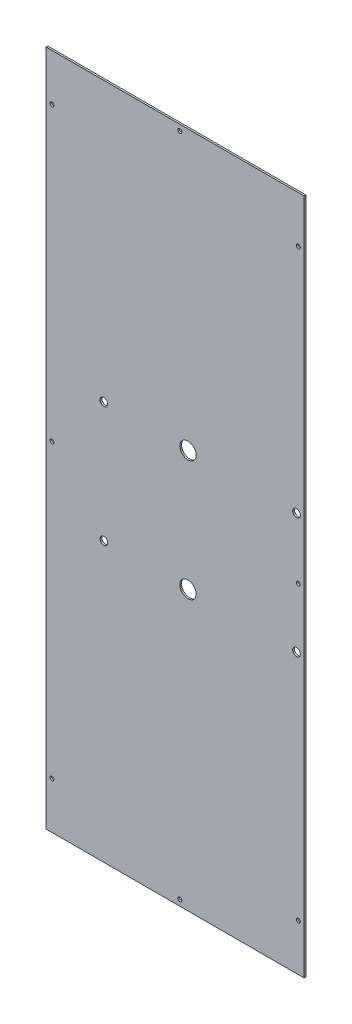
ISO-10303-21;
HEADER;
FILE_DESCRIPTION(('STEP AP214'),'2;1');
FILE_NAME('part.step','',(''),(''),'','','');
FILE_SCHEMA(('AUTOMOTIVE_DESIGN { 1 0 10303 214 1 1 1 1 }'));
ENDSEC;
DATA;
#1=APPLICATION_CONTEXT('core data for automotive mechanical design processes');
#2=APPLICATION_PROTOCOL_DEFINITION('international standard','automotive_design',2000,#1);
#3=PRODUCT_CONTEXT('',#1,'mechanical');
#4=PRODUCT('Part','Part','',(#3));
#5=PRODUCT_RELATED_PRODUCT_CATEGORY('part','',(#4));
#6=PRODUCT_DEFINITION_FORMATION('','',#4);
#7=PRODUCT_DEFINITION_CONTEXT('part definition',#1,'design');
#8=PRODUCT_DEFINITION('design','',#6,#7);
#9=PRODUCT_DEFINITION_SHAPE('','',#8);
#10=(LENGTH_UNIT() NAMED_UNIT(*) SI_UNIT(.MILLI.,.METRE.));
#11=(NAMED_UNIT(*) PLANE_ANGLE_UNIT() SI_UNIT($,.RADIAN.));
#12=(NAMED_UNIT(*) SI_UNIT($,.STERADIAN.) SOLID_ANGLE_UNIT());
#13=UNCERTAINTY_MEASURE_WITH_UNIT(LENGTH_MEASURE(1.E-05),#10,'distance_accuracy_value','');
#14=(GEOMETRIC_REPRESENTATION_CONTEXT(3) GLOBAL_UNCERTAINTY_ASSIGNED_CONTEXT((#13)) GLOBAL_UNIT_ASSIGNED_CONTEXT((#10,
#11,#12)) REPRESENTATION_CONTEXT('',''));
#15=CARTESIAN_POINT('',(0.,0.,0.));
#16=DIRECTION('',(0.,0.,1.));
#17=DIRECTION('',(1.,0.,0.));
#18=AXIS2_PLACEMENT_3D('',#15,#16,#17);
#19=CARTESIAN_POINT('',(-139.5,290.,110.));
#20=DIRECTION('',(-1.,0.,0.));
#21=DIRECTION('',(0.,0.,1.));
#22=AXIS2_PLACEMENT_3D('',#19,#20,#21);
#23=PLANE('',#22);
#24=DIRECTION('',(0.,-1.,0.));
#25=VECTOR('',#24,1.);
#26=CARTESIAN_POINT('',(-139.5,290.,111.5));
#27=LINE('',#26,#25);
#28=CARTESIAN_POINT('',(-139.5,290.,111.5));
#29=VERTEX_POINT('',#28);
#30=CARTESIAN_POINT('',(-139.5,-290.,111.5));
#31=VERTEX_POINT('',#30);
#32=EDGE_CURVE('E106',#29,#31,#27,.T.);
#33=ORIENTED_EDGE('',*,*,#32,.F.);
#34=DIRECTION('',(0.,0.,1.));
#35=VECTOR('',#34,1.);
#36=CARTESIAN_POINT('',(-139.5,290.,110.));
#37=LINE('',#36,#35);
#38=CARTESIAN_POINT('',(-139.5,290.,110.));
#39=VERTEX_POINT('',#38);
#40=EDGE_CURVE('E11',#39,#29,#37,.T.);
#41=ORIENTED_EDGE('',*,*,#40,.F.);
#42=DIRECTION('',(0.,-1.,0.));
#43=VECTOR('',#42,1.);
#44=CARTESIAN_POINT('',(-139.5,290.,110.));
#45=LINE('',#44,#43);
#46=CARTESIAN_POINT('',(-139.5,-290.,110.));
#47=VERTEX_POINT('',#46);
#48=EDGE_CURVE('E97',#39,#47,#45,.T.);
#49=ORIENTED_EDGE('',*,*,#48,.T.);
#50=DIRECTION('',(0.,0.,1.));
#51=VECTOR('',#50,1.);
#52=CARTESIAN_POINT('',(-139.5,-290.,110.));
#53=LINE('',#52,#51);
#54=EDGE_CURVE('E42',#47,#31,#53,.T.);
#55=ORIENTED_EDGE('',*,*,#54,.T.);
#56=EDGE_LOOP('',(#33,#41,#49,#55));
#57=FACE_BOUND('',#56,.T.);
#58=ADVANCED_FACE('F41',(#57),#23,.T.);
#59=CARTESIAN_POINT('',(-139.5,290.,110.));
#60=DIRECTION('',(0.,1.,0.));
#61=DIRECTION('',(0.,0.,1.));
#62=AXIS2_PLACEMENT_3D('',#59,#60,#61);
#63=PLANE('',#62);
#64=DIRECTION('',(-1.,0.,0.));
#65=VECTOR('',#64,1.);
#66=CARTESIAN_POINT('',(-139.5,290.,111.5));
#67=LINE('',#66,#65);
#68=CARTESIAN_POINT('',(81.5,290.,111.5));
#69=VERTEX_POINT('',#68);
#70=EDGE_CURVE('E101',#69,#29,#67,.T.);
#71=ORIENTED_EDGE('',*,*,#70,.F.);
#72=DIRECTION('',(0.,0.,1.));
#73=VECTOR('',#72,1.);
#74=CARTESIAN_POINT('',(81.5,290.,110.));
#75=LINE('',#74,#73);
#76=CARTESIAN_POINT('',(81.5,290.,110.));
#77=VERTEX_POINT('',#76);
#78=EDGE_CURVE('E49',#77,#69,#75,.T.);
#79=ORIENTED_EDGE('',*,*,#78,.F.);
#80=DIRECTION('',(-1.,0.,0.));
#81=VECTOR('',#80,1.);
#82=CARTESIAN_POINT('',(-139.5,290.,110.));
#83=LINE('',#82,#81);
#84=EDGE_CURVE('E96',#77,#39,#83,.T.);
#85=ORIENTED_EDGE('',*,*,#84,.T.);
#86=ORIENTED_EDGE('',*,*,#40,.T.);
#87=EDGE_LOOP('',(#71,#79,#85,#86));
#88=FACE_BOUND('',#87,.T.);
#89=ADVANCED_FACE('F120',(#88),#63,.T.);
#90=CARTESIAN_POINT('',(81.5,290.,110.));
#91=DIRECTION('',(1.,0.,0.));
#92=DIRECTION('',(0.,0.,-1.));
#93=AXIS2_PLACEMENT_3D('',#90,#91,#92);
#94=PLANE('',#93);
#95=DIRECTION('',(0.,1.,0.));
#96=VECTOR('',#95,1.);
#97=CARTESIAN_POINT('',(81.5,290.,111.5));
#98=LINE('',#97,#96);
#99=CARTESIAN_POINT('',(81.5,-290.,111.5));
#100=VERTEX_POINT('',#99);
#101=EDGE_CURVE('E93',#100,#69,#98,.T.);
#102=ORIENTED_EDGE('',*,*,#101,.F.);
#103=DIRECTION('',(0.,0.,1.));
#104=VECTOR('',#103,1.);
#105=CARTESIAN_POINT('',(81.5,-290.,110.));
#106=LINE('',#105,#104);
#107=CARTESIAN_POINT('',(81.5,-290.,110.));
#108=VERTEX_POINT('',#107);
#109=EDGE_CURVE('E88',#108,#100,#106,.T.);
#110=ORIENTED_EDGE('',*,*,#109,.F.);
#111=DIRECTION('',(0.,1.,0.));
#112=VECTOR('',#111,1.);
#113=CARTESIAN_POINT('',(81.5,290.,110.));
#114=LINE('',#113,#112);
#115=EDGE_CURVE('E90',#108,#77,#114,.T.);
#116=ORIENTED_EDGE('',*,*,#115,.T.);
#117=ORIENTED_EDGE('',*,*,#78,.T.);
#118=EDGE_LOOP('',(#102,#110,#116,#117));
#119=FACE_BOUND('',#118,.T.);
#120=ADVANCED_FACE('F86',(#119),#94,.T.);
#121=CARTESIAN_POINT('',(-139.5,-290.,110.));
#122=DIRECTION('',(0.,-1.,0.));
#123=DIRECTION('',(0.,0.,-1.));
#124=AXIS2_PLACEMENT_3D('',#121,#122,#123);
#125=PLANE('',#124);
#126=DIRECTION('',(1.,0.,0.));
#127=VECTOR('',#126,1.);
#128=CARTESIAN_POINT('',(-139.5,-290.,111.5));
#129=LINE('',#128,#127);
#130=EDGE_CURVE('E108',#31,#100,#129,.T.);
#131=ORIENTED_EDGE('',*,*,#130,.F.);
#132=ORIENTED_EDGE('',*,*,#54,.F.);
#133=DIRECTION('',(1.,0.,0.));
#134=VECTOR('',#133,1.);
#135=CARTESIAN_POINT('',(-139.5,-290.,110.));
#136=LINE('',#135,#134);
#137=EDGE_CURVE('E92',#47,#108,#136,.T.);
#138=ORIENTED_EDGE('',*,*,#137,.T.);
#139=ORIENTED_EDGE('',*,*,#109,.T.);
#140=EDGE_LOOP('',(#131,#132,#138,#139));
#141=FACE_BOUND('',#140,.T.);
#142=ADVANCED_FACE('F98',(#141),#125,.T.);
#143=CARTESIAN_POINT('',(0.,0.,110.));
#144=DIRECTION('',(0.,0.,1.));
#145=DIRECTION('',(1.,0.,0.));
#146=AXIS2_PLACEMENT_3D('',#143,#144,#145);
#147=PLANE('',#146);
#148=CARTESIAN_POINT('',(76.5,250.,110.));
#149=DIRECTION('',(0.,0.,1.));
#150=DIRECTION('',(1.,0.,0.));
#151=AXIS2_PLACEMENT_3D('',#148,#149,#150);
#152=CIRCLE('',#151,1.69999999999999);
#153=CARTESIAN_POINT('',(78.2,250.,110.));
#154=VERTEX_POINT('',#153);
#155=EDGE_CURVE('E196',#154,#154,#152,.T.);
#156=ORIENTED_EDGE('',*,*,#155,.T.);
#157=EDGE_LOOP('',(#156));
#158=FACE_BOUND('',#157,.T.);
#159=CARTESIAN_POINT('',(-25.,285.,110.));
#160=DIRECTION('',(0.,0.,1.));
#161=DIRECTION('',(1.,0.,0.));
#162=AXIS2_PLACEMENT_3D('',#159,#160,#161);
#163=CIRCLE('',#162,1.7);
#164=CARTESIAN_POINT('',(-23.3,285.,110.));
#165=VERTEX_POINT('',#164);
#166=EDGE_CURVE('E206',#165,#165,#163,.T.);
#167=ORIENTED_EDGE('',*,*,#166,.T.);
#168=EDGE_LOOP('',(#167));
#169=FACE_BOUND('',#168,.T.);
#170=CARTESIAN_POINT('',(75.,51.5,110.));
#171=DIRECTION('',(0.,0.,1.));
#172=DIRECTION('',(1.,0.,0.));
#173=AXIS2_PLACEMENT_3D('',#170,#171,#172);
#174=CIRCLE('',#173,3.3);
#175=CARTESIAN_POINT('',(78.3,51.5,110.));
#176=VERTEX_POINT('',#175);
#177=EDGE_CURVE('E215',#176,#176,#174,.T.);
#178=ORIENTED_EDGE('',*,*,#177,.T.);
#179=EDGE_LOOP('',(#178));
#180=FACE_BOUND('',#179,.T.);
#181=CARTESIAN_POINT('',(76.5,0.,110.));
#182=DIRECTION('',(0.,0.,1.));
#183=DIRECTION('',(1.,0.,0.));
#184=AXIS2_PLACEMENT_3D('',#181,#182,#183);
#185=CIRCLE('',#184,1.69999999999999);
#186=CARTESIAN_POINT('',(78.2,0.,110.));
#187=VERTEX_POINT('',#186);
#188=EDGE_CURVE('E217',#187,#187,#185,.T.);
#189=ORIENTED_EDGE('',*,*,#188,.T.);
#190=EDGE_LOOP('',(#189));
#191=FACE_BOUND('',#190,.T.);
#192=CARTESIAN_POINT('',(-18.,51.5,110.));
#193=DIRECTION('',(0.,0.,1.));
#194=DIRECTION('',(1.,0.,0.));
#195=AXIS2_PLACEMENT_3D('',#192,#193,#194);
#196=CIRCLE('',#195,7.);
#197=CARTESIAN_POINT('',(-11.,51.5,110.));
#198=VERTEX_POINT('',#197);
#199=EDGE_CURVE('E221',#198,#198,#196,.T.);
#200=ORIENTED_EDGE('',*,*,#199,.T.);
#201=EDGE_LOOP('',(#200));
#202=FACE_BOUND('',#201,.T.);
#203=CARTESIAN_POINT('',(-134.5,250.,110.));
#204=DIRECTION('',(0.,0.,1.));
#205=DIRECTION('',(1.,0.,0.));
#206=AXIS2_PLACEMENT_3D('',#203,#204,#205);
#207=CIRCLE('',#206,1.70000000000001);
#208=CARTESIAN_POINT('',(-132.8,250.,110.));
#209=VERTEX_POINT('',#208);
#210=EDGE_CURVE('E228',#209,#209,#207,.T.);
#211=ORIENTED_EDGE('',*,*,#210,.T.);
#212=EDGE_LOOP('',(#211));
#213=FACE_BOUND('',#212,.T.);
#214=CARTESIAN_POINT('',(-90.,51.5,110.));
#215=DIRECTION('',(0.,0.,1.));
#216=DIRECTION('',(1.,0.,0.));
#217=AXIS2_PLACEMENT_3D('',#214,#215,#216);
#218=CIRCLE('',#217,3.3);
#219=CARTESIAN_POINT('',(-86.7,51.5,110.));
#220=VERTEX_POINT('',#219);
#221=EDGE_CURVE('E237',#220,#220,#218,.T.);
#222=ORIENTED_EDGE('',*,*,#221,.T.);
#223=EDGE_LOOP('',(#222));
#224=FACE_BOUND('',#223,.T.);
#225=CARTESIAN_POINT('',(-134.5,0.,110.));
#226=DIRECTION('',(0.,0.,1.));
#227=DIRECTION('',(1.,0.,0.));
#228=AXIS2_PLACEMENT_3D('',#225,#226,#227);
#229=CIRCLE('',#228,1.70000000000001);
#230=CARTESIAN_POINT('',(-132.8,0.,110.));
#231=VERTEX_POINT('',#230);
#232=EDGE_CURVE('E245',#231,#231,#229,.T.);
#233=ORIENTED_EDGE('',*,*,#232,.T.);
#234=EDGE_LOOP('',(#233));
#235=FACE_BOUND('',#234,.T.);
#236=CARTESIAN_POINT('',(75.,-51.5,110.));
#237=DIRECTION('',(0.,0.,1.));
#238=DIRECTION('',(1.,0.,0.));
#239=AXIS2_PLACEMENT_3D('',#236,#237,#238);
#240=CIRCLE('',#239,3.3);
#241=CARTESIAN_POINT('',(78.3,-51.5,110.));
#242=VERTEX_POINT('',#241);
#243=EDGE_CURVE('E249',#242,#242,#240,.T.);
#244=ORIENTED_EDGE('',*,*,#243,.T.);
#245=EDGE_LOOP('',(#244));
#246=FACE_BOUND('',#245,.T.);
#247=CARTESIAN_POINT('',(-18.,-51.5,110.));
#248=DIRECTION('',(0.,0.,1.));
#249=DIRECTION('',(1.,0.,0.));
#250=AXIS2_PLACEMENT_3D('',#247,#248,#249);
#251=CIRCLE('',#250,7.);
#252=CARTESIAN_POINT('',(-11.,-51.5,110.));
#253=VERTEX_POINT('',#252);
#254=EDGE_CURVE('E255',#253,#253,#251,.T.);
#255=ORIENTED_EDGE('',*,*,#254,.T.);
#256=EDGE_LOOP('',(#255));
#257=FACE_BOUND('',#256,.T.);
#258=CARTESIAN_POINT('',(76.5,-250.,110.));
#259=DIRECTION('',(0.,0.,1.));
#260=DIRECTION('',(1.,0.,0.));
#261=AXIS2_PLACEMENT_3D('',#258,#259,#260);
#262=CIRCLE('',#261,1.69999999999999);
#263=CARTESIAN_POINT('',(78.2,-250.,110.));
#264=VERTEX_POINT('',#263);
#265=EDGE_CURVE('E257',#264,#264,#262,.T.);
#266=ORIENTED_EDGE('',*,*,#265,.T.);
#267=EDGE_LOOP('',(#266));
#268=FACE_BOUND('',#267,.T.);
#269=CARTESIAN_POINT('',(-25.,-285.,110.));
#270=DIRECTION('',(0.,0.,1.));
#271=DIRECTION('',(1.,0.,0.));
#272=AXIS2_PLACEMENT_3D('',#269,#270,#271);
#273=CIRCLE('',#272,1.7);
#274=CARTESIAN_POINT('',(-23.3,-285.,110.));
#275=VERTEX_POINT('',#274);
#276=EDGE_CURVE('E266',#275,#275,#273,.T.);
#277=ORIENTED_EDGE('',*,*,#276,.T.);
#278=EDGE_LOOP('',(#277));
#279=FACE_BOUND('',#278,.T.);
#280=CARTESIAN_POINT('',(-90.,-51.5,110.));
#281=DIRECTION('',(0.,0.,1.));
#282=DIRECTION('',(1.,0.,0.));
#283=AXIS2_PLACEMENT_3D('',#280,#281,#282);
#284=CIRCLE('',#283,3.3);
#285=CARTESIAN_POINT('',(-86.7,-51.5,110.));
#286=VERTEX_POINT('',#285);
#287=EDGE_CURVE('E275',#286,#286,#284,.T.);
#288=ORIENTED_EDGE('',*,*,#287,.T.);
#289=EDGE_LOOP('',(#288));
#290=FACE_BOUND('',#289,.T.);
#291=CARTESIAN_POINT('',(-134.5,-250.,110.));
#292=DIRECTION('',(0.,0.,1.));
#293=DIRECTION('',(1.,0.,0.));
#294=AXIS2_PLACEMENT_3D('',#291,#292,#293);
#295=CIRCLE('',#294,1.70000000000001);
#296=CARTESIAN_POINT('',(-132.8,-250.,110.));
#297=VERTEX_POINT('',#296);
#298=EDGE_CURVE('E109',#297,#297,#295,.T.);
#299=ORIENTED_EDGE('',*,*,#298,.T.);
#300=EDGE_LOOP('',(#299));
#301=FACE_BOUND('',#300,.T.);
#302=ORIENTED_EDGE('',*,*,#48,.F.);
#303=ORIENTED_EDGE('',*,*,#84,.F.);
#304=ORIENTED_EDGE('',*,*,#115,.F.);
#305=ORIENTED_EDGE('',*,*,#137,.F.);
#306=EDGE_LOOP('',(#302,#303,#304,#305));
#307=FACE_BOUND('',#306,.T.);
#308=ADVANCED_FACE('F94',(#158,#169,#180,#191,#202,#213,#224,#235,#246,#257,#268,#279,#290,#301,
#307),#147,.F.);
#309=CARTESIAN_POINT('',(0.,0.,111.5));
#310=DIRECTION('',(0.,0.,1.));
#311=DIRECTION('',(1.,0.,0.));
#312=AXIS2_PLACEMENT_3D('',#309,#310,#311);
#313=PLANE('',#312);
#314=CARTESIAN_POINT('',(76.5,250.,111.5));
#315=DIRECTION('',(0.,0.,1.));
#316=DIRECTION('',(1.,0.,0.));
#317=AXIS2_PLACEMENT_3D('',#314,#315,#316);
#318=CIRCLE('',#317,1.69999999999999);
#319=CARTESIAN_POINT('',(78.2,250.,111.5));
#320=VERTEX_POINT('',#319);
#321=EDGE_CURVE('E203',#320,#320,#318,.T.);
#322=ORIENTED_EDGE('',*,*,#321,.F.);
#323=EDGE_LOOP('',(#322));
#324=FACE_BOUND('',#323,.T.);
#325=CARTESIAN_POINT('',(-25.,285.,111.5));
#326=DIRECTION('',(0.,0.,1.));
#327=DIRECTION('',(1.,0.,0.));
#328=AXIS2_PLACEMENT_3D('',#325,#326,#327);
#329=CIRCLE('',#328,1.7);
#330=CARTESIAN_POINT('',(-23.3,285.,111.5));
#331=VERTEX_POINT('',#330);
#332=EDGE_CURVE('E201',#331,#331,#329,.T.);
#333=ORIENTED_EDGE('',*,*,#332,.F.);
#334=EDGE_LOOP('',(#333));
#335=FACE_BOUND('',#334,.T.);
#336=CARTESIAN_POINT('',(75.,51.5,111.5));
#337=DIRECTION('',(0.,0.,1.));
#338=DIRECTION('',(1.,0.,0.));
#339=AXIS2_PLACEMENT_3D('',#336,#337,#338);
#340=CIRCLE('',#339,3.3);
#341=CARTESIAN_POINT('',(78.3,51.5,111.5));
#342=VERTEX_POINT('',#341);
#343=EDGE_CURVE('E207',#342,#342,#340,.T.);
#344=ORIENTED_EDGE('',*,*,#343,.F.);
#345=EDGE_LOOP('',(#344));
#346=FACE_BOUND('',#345,.T.);
#347=CARTESIAN_POINT('',(76.5,0.,111.5));
#348=DIRECTION('',(0.,0.,1.));
#349=DIRECTION('',(1.,0.,0.));
#350=AXIS2_PLACEMENT_3D('',#347,#348,#349);
#351=CIRCLE('',#350,1.69999999999999);
#352=CARTESIAN_POINT('',(78.2,0.,111.5));
#353=VERTEX_POINT('',#352);
#354=EDGE_CURVE('E214',#353,#353,#351,.T.);
#355=ORIENTED_EDGE('',*,*,#354,.F.);
#356=EDGE_LOOP('',(#355));
#357=FACE_BOUND('',#356,.T.);
#358=CARTESIAN_POINT('',(-18.,51.5,111.5));
#359=DIRECTION('',(0.,0.,1.));
#360=DIRECTION('',(1.,0.,0.));
#361=AXIS2_PLACEMENT_3D('',#358,#359,#360);
#362=CIRCLE('',#361,7.);
#363=CARTESIAN_POINT('',(-11.,51.5,111.5));
#364=VERTEX_POINT('',#363);
#365=EDGE_CURVE('E222',#364,#364,#362,.T.);
#366=ORIENTED_EDGE('',*,*,#365,.F.);
#367=EDGE_LOOP('',(#366));
#368=FACE_BOUND('',#367,.T.);
#369=CARTESIAN_POINT('',(-134.5,250.,111.5));
#370=DIRECTION('',(0.,0.,1.));
#371=DIRECTION('',(1.,0.,0.));
#372=AXIS2_PLACEMENT_3D('',#369,#370,#371);
#373=CIRCLE('',#372,1.70000000000001);
#374=CARTESIAN_POINT('',(-132.8,250.,111.5));
#375=VERTEX_POINT('',#374);
#376=EDGE_CURVE('E230',#375,#375,#373,.T.);
#377=ORIENTED_EDGE('',*,*,#376,.F.);
#378=EDGE_LOOP('',(#377));
#379=FACE_BOUND('',#378,.T.);
#380=CARTESIAN_POINT('',(-90.,51.5,111.5));
#381=DIRECTION('',(0.,0.,1.));
#382=DIRECTION('',(1.,0.,0.));
#383=AXIS2_PLACEMENT_3D('',#380,#381,#382);
#384=CIRCLE('',#383,3.3);
#385=CARTESIAN_POINT('',(-86.7,51.5,111.5));
#386=VERTEX_POINT('',#385);
#387=EDGE_CURVE('E234',#386,#386,#384,.T.);
#388=ORIENTED_EDGE('',*,*,#387,.F.);
#389=EDGE_LOOP('',(#388));
#390=FACE_BOUND('',#389,.T.);
#391=CARTESIAN_POINT('',(-134.5,0.,111.5));
#392=DIRECTION('',(0.,0.,1.));
#393=DIRECTION('',(1.,0.,0.));
#394=AXIS2_PLACEMENT_3D('',#391,#392,#393);
#395=CIRCLE('',#394,1.70000000000001);
#396=CARTESIAN_POINT('',(-132.8,0.,111.5));
#397=VERTEX_POINT('',#396);
#398=EDGE_CURVE('E239',#397,#397,#395,.T.);
#399=ORIENTED_EDGE('',*,*,#398,.F.);
#400=EDGE_LOOP('',(#399));
#401=FACE_BOUND('',#400,.T.);
#402=CARTESIAN_POINT('',(75.,-51.5,111.5));
#403=DIRECTION('',(0.,0.,1.));
#404=DIRECTION('',(1.,0.,0.));
#405=AXIS2_PLACEMENT_3D('',#402,#403,#404);
#406=CIRCLE('',#405,3.3);
#407=CARTESIAN_POINT('',(78.3,-51.5,111.5));
#408=VERTEX_POINT('',#407);
#409=EDGE_CURVE('E243',#408,#408,#406,.T.);
#410=ORIENTED_EDGE('',*,*,#409,.F.);
#411=EDGE_LOOP('',(#410));
#412=FACE_BOUND('',#411,.T.);
#413=CARTESIAN_POINT('',(-18.,-51.5,111.5));
#414=DIRECTION('',(0.,0.,1.));
#415=DIRECTION('',(1.,0.,0.));
#416=AXIS2_PLACEMENT_3D('',#413,#414,#415);
#417=CIRCLE('',#416,7.);
#418=CARTESIAN_POINT('',(-11.,-51.5,111.5));
#419=VERTEX_POINT('',#418);
#420=EDGE_CURVE('E253',#419,#419,#417,.T.);
#421=ORIENTED_EDGE('',*,*,#420,.F.);
#422=EDGE_LOOP('',(#421));
#423=FACE_BOUND('',#422,.T.);
#424=CARTESIAN_POINT('',(76.5,-250.,111.5));
#425=DIRECTION('',(0.,0.,1.));
#426=DIRECTION('',(1.,0.,0.));
#427=AXIS2_PLACEMENT_3D('',#424,#425,#426);
#428=CIRCLE('',#427,1.69999999999999);
#429=CARTESIAN_POINT('',(78.2,-250.,111.5));
#430=VERTEX_POINT('',#429);
#431=EDGE_CURVE('E260',#430,#430,#428,.T.);
#432=ORIENTED_EDGE('',*,*,#431,.F.);
#433=EDGE_LOOP('',(#432));
#434=FACE_BOUND('',#433,.T.);
#435=CARTESIAN_POINT('',(-25.,-285.,111.5));
#436=DIRECTION('',(0.,0.,1.));
#437=DIRECTION('',(1.,0.,0.));
#438=AXIS2_PLACEMENT_3D('',#435,#436,#437);
#439=CIRCLE('',#438,1.7);
#440=CARTESIAN_POINT('',(-23.3,-285.,111.5));
#441=VERTEX_POINT('',#440);
#442=EDGE_CURVE('E263',#441,#441,#439,.T.);
#443=ORIENTED_EDGE('',*,*,#442,.F.);
#444=EDGE_LOOP('',(#443));
#445=FACE_BOUND('',#444,.T.);
#446=CARTESIAN_POINT('',(-90.,-51.5,111.5));
#447=DIRECTION('',(0.,0.,1.));
#448=DIRECTION('',(1.,0.,0.));
#449=AXIS2_PLACEMENT_3D('',#446,#447,#448);
#450=CIRCLE('',#449,3.3);
#451=CARTESIAN_POINT('',(-86.7,-51.5,111.5));
#452=VERTEX_POINT('',#451);
#453=EDGE_CURVE('E267',#452,#452,#450,.T.);
#454=ORIENTED_EDGE('',*,*,#453,.F.);
#455=EDGE_LOOP('',(#454));
#456=FACE_BOUND('',#455,.T.);
#457=CARTESIAN_POINT('',(-134.5,-250.,111.5));
#458=DIRECTION('',(0.,0.,1.));
#459=DIRECTION('',(1.,0.,0.));
#460=AXIS2_PLACEMENT_3D('',#457,#458,#459);
#461=CIRCLE('',#460,1.70000000000001);
#462=CARTESIAN_POINT('',(-132.8,-250.,111.5));
#463=VERTEX_POINT('',#462);
#464=EDGE_CURVE('E274',#463,#463,#461,.T.);
#465=ORIENTED_EDGE('',*,*,#464,.F.);
#466=EDGE_LOOP('',(#465));
#467=FACE_BOUND('',#466,.T.);
#468=ORIENTED_EDGE('',*,*,#32,.T.);
#469=ORIENTED_EDGE('',*,*,#130,.T.);
#470=ORIENTED_EDGE('',*,*,#101,.T.);
#471=ORIENTED_EDGE('',*,*,#70,.T.);
#472=EDGE_LOOP('',(#468,#469,#470,#471));
#473=FACE_BOUND('',#472,.T.);
#474=ADVANCED_FACE('F117',(#324,#335,#346,#357,#368,#379,#390,#401,#412,#423,#434,#445,#456,
#467,#473),#313,.T.);
#475=CARTESIAN_POINT('',(-134.5,-250.,110.));
#476=DIRECTION('',(0.,0.,1.));
#477=DIRECTION('',(1.,0.,0.));
#478=AXIS2_PLACEMENT_3D('',#475,#476,#477);
#479=CYLINDRICAL_SURFACE('',#478,1.70000000000001);
#480=ORIENTED_EDGE('',*,*,#298,.F.);
#481=EDGE_LOOP('',(#480));
#482=FACE_BOUND('',#481,.T.);
#483=ORIENTED_EDGE('',*,*,#464,.T.);
#484=EDGE_LOOP('',(#483));
#485=FACE_BOUND('',#484,.T.);
#486=ADVANCED_FACE('F133',(#482,#485),#479,.F.);
#487=CARTESIAN_POINT('',(-90.,-51.5,110.));
#488=DIRECTION('',(0.,0.,1.));
#489=DIRECTION('',(1.,0.,0.));
#490=AXIS2_PLACEMENT_3D('',#487,#488,#489);
#491=CYLINDRICAL_SURFACE('',#490,3.3);
#492=ORIENTED_EDGE('',*,*,#287,.F.);
#493=EDGE_LOOP('',(#492));
#494=FACE_BOUND('',#493,.T.);
#495=ORIENTED_EDGE('',*,*,#453,.T.);
#496=EDGE_LOOP('',(#495));
#497=FACE_BOUND('',#496,.T.);
#498=ADVANCED_FACE('F142',(#494,#497),#491,.F.);
#499=CARTESIAN_POINT('',(-25.,-285.,110.));
#500=DIRECTION('',(0.,0.,1.));
#501=DIRECTION('',(1.,0.,0.));
#502=AXIS2_PLACEMENT_3D('',#499,#500,#501);
#503=CYLINDRICAL_SURFACE('',#502,1.7);
#504=ORIENTED_EDGE('',*,*,#276,.F.);
#505=EDGE_LOOP('',(#504));
#506=FACE_BOUND('',#505,.T.);
#507=ORIENTED_EDGE('',*,*,#442,.T.);
#508=EDGE_LOOP('',(#507));
#509=FACE_BOUND('',#508,.T.);
#510=ADVANCED_FACE('F148',(#506,#509),#503,.F.);
#511=CARTESIAN_POINT('',(76.5,-250.,110.));
#512=DIRECTION('',(0.,0.,1.));
#513=DIRECTION('',(1.,0.,0.));
#514=AXIS2_PLACEMENT_3D('',#511,#512,#513);
#515=CYLINDRICAL_SURFACE('',#514,1.69999999999999);
#516=ORIENTED_EDGE('',*,*,#265,.F.);
#517=EDGE_LOOP('',(#516));
#518=FACE_BOUND('',#517,.T.);
#519=ORIENTED_EDGE('',*,*,#431,.T.);
#520=EDGE_LOOP('',(#519));
#521=FACE_BOUND('',#520,.T.);
#522=ADVANCED_FACE('F147',(#518,#521),#515,.F.);
#523=CARTESIAN_POINT('',(-18.,-51.5,110.));
#524=DIRECTION('',(0.,0.,1.));
#525=DIRECTION('',(1.,0.,0.));
#526=AXIS2_PLACEMENT_3D('',#523,#524,#525);
#527=CYLINDRICAL_SURFACE('',#526,7.);
#528=ORIENTED_EDGE('',*,*,#254,.F.);
#529=EDGE_LOOP('',(#528));
#530=FACE_BOUND('',#529,.T.);
#531=ORIENTED_EDGE('',*,*,#420,.T.);
#532=EDGE_LOOP('',(#531));
#533=FACE_BOUND('',#532,.T.);
#534=ADVANCED_FACE('F152',(#530,#533),#527,.F.);
#535=CARTESIAN_POINT('',(75.,-51.5,110.));
#536=DIRECTION('',(0.,0.,1.));
#537=DIRECTION('',(1.,0.,0.));
#538=AXIS2_PLACEMENT_3D('',#535,#536,#537);
#539=CYLINDRICAL_SURFACE('',#538,3.3);
#540=ORIENTED_EDGE('',*,*,#243,.F.);
#541=EDGE_LOOP('',(#540));
#542=FACE_BOUND('',#541,.T.);
#543=ORIENTED_EDGE('',*,*,#409,.T.);
#544=EDGE_LOOP('',(#543));
#545=FACE_BOUND('',#544,.T.);
#546=ADVANCED_FACE('F158',(#542,#545),#539,.F.);
#547=CARTESIAN_POINT('',(-134.5,0.,110.));
#548=DIRECTION('',(0.,0.,1.));
#549=DIRECTION('',(1.,0.,0.));
#550=AXIS2_PLACEMENT_3D('',#547,#548,#549);
#551=CYLINDRICAL_SURFACE('',#550,1.70000000000001);
#552=ORIENTED_EDGE('',*,*,#232,.F.);
#553=EDGE_LOOP('',(#552));
#554=FACE_BOUND('',#553,.T.);
#555=ORIENTED_EDGE('',*,*,#398,.T.);
#556=EDGE_LOOP('',(#555));
#557=FACE_BOUND('',#556,.T.);
#558=ADVANCED_FACE('F165',(#554,#557),#551,.F.);
#559=CARTESIAN_POINT('',(-90.,51.5,110.));
#560=DIRECTION('',(0.,0.,1.));
#561=DIRECTION('',(1.,0.,0.));
#562=AXIS2_PLACEMENT_3D('',#559,#560,#561);
#563=CYLINDRICAL_SURFACE('',#562,3.3);
#564=ORIENTED_EDGE('',*,*,#221,.F.);
#565=EDGE_LOOP('',(#564));
#566=FACE_BOUND('',#565,.T.);
#567=ORIENTED_EDGE('',*,*,#387,.T.);
#568=EDGE_LOOP('',(#567));
#569=FACE_BOUND('',#568,.T.);
#570=ADVANCED_FACE('F167',(#566,#569),#563,.F.);
#571=CARTESIAN_POINT('',(-134.5,250.,110.));
#572=DIRECTION('',(0.,0.,1.));
#573=DIRECTION('',(1.,0.,0.));
#574=AXIS2_PLACEMENT_3D('',#571,#572,#573);
#575=CYLINDRICAL_SURFACE('',#574,1.70000000000001);
#576=ORIENTED_EDGE('',*,*,#210,.F.);
#577=EDGE_LOOP('',(#576));
#578=FACE_BOUND('',#577,.T.);
#579=ORIENTED_EDGE('',*,*,#376,.T.);
#580=EDGE_LOOP('',(#579));
#581=FACE_BOUND('',#580,.T.);
#582=ADVANCED_FACE('F168',(#578,#581),#575,.F.);
#583=CARTESIAN_POINT('',(-18.,51.5,110.));
#584=DIRECTION('',(0.,0.,1.));
#585=DIRECTION('',(1.,0.,0.));
#586=AXIS2_PLACEMENT_3D('',#583,#584,#585);
#587=CYLINDRICAL_SURFACE('',#586,7.);
#588=ORIENTED_EDGE('',*,*,#199,.F.);
#589=EDGE_LOOP('',(#588));
#590=FACE_BOUND('',#589,.T.);
#591=ORIENTED_EDGE('',*,*,#365,.T.);
#592=EDGE_LOOP('',(#591));
#593=FACE_BOUND('',#592,.T.);
#594=ADVANCED_FACE('F171',(#590,#593),#587,.F.);
#595=CARTESIAN_POINT('',(76.5,0.,110.));
#596=DIRECTION('',(0.,0.,1.));
#597=DIRECTION('',(1.,0.,0.));
#598=AXIS2_PLACEMENT_3D('',#595,#596,#597);
#599=CYLINDRICAL_SURFACE('',#598,1.69999999999999);
#600=ORIENTED_EDGE('',*,*,#188,.F.);
#601=EDGE_LOOP('',(#600));
#602=FACE_BOUND('',#601,.T.);
#603=ORIENTED_EDGE('',*,*,#354,.T.);
#604=EDGE_LOOP('',(#603));
#605=FACE_BOUND('',#604,.T.);
#606=ADVANCED_FACE('F179',(#602,#605),#599,.F.);
#607=CARTESIAN_POINT('',(75.,51.5,110.));
#608=DIRECTION('',(0.,0.,1.));
#609=DIRECTION('',(1.,0.,0.));
#610=AXIS2_PLACEMENT_3D('',#607,#608,#609);
#611=CYLINDRICAL_SURFACE('',#610,3.3);
#612=ORIENTED_EDGE('',*,*,#177,.F.);
#613=EDGE_LOOP('',(#612));
#614=FACE_BOUND('',#613,.T.);
#615=ORIENTED_EDGE('',*,*,#343,.T.);
#616=EDGE_LOOP('',(#615));
#617=FACE_BOUND('',#616,.T.);
#618=ADVANCED_FACE('F185',(#614,#617),#611,.F.);
#619=CARTESIAN_POINT('',(-25.,285.,110.));
#620=DIRECTION('',(0.,0.,1.));
#621=DIRECTION('',(1.,0.,0.));
#622=AXIS2_PLACEMENT_3D('',#619,#620,#621);
#623=CYLINDRICAL_SURFACE('',#622,1.7);
#624=ORIENTED_EDGE('',*,*,#166,.F.);
#625=EDGE_LOOP('',(#624));
#626=FACE_BOUND('',#625,.T.);
#627=ORIENTED_EDGE('',*,*,#332,.T.);
#628=EDGE_LOOP('',(#627));
#629=FACE_BOUND('',#628,.T.);
#630=ADVANCED_FACE('F187',(#626,#629),#623,.F.);
#631=CARTESIAN_POINT('',(76.5,250.,110.));
#632=DIRECTION('',(0.,0.,1.));
#633=DIRECTION('',(1.,0.,0.));
#634=AXIS2_PLACEMENT_3D('',#631,#632,#633);
#635=CYLINDRICAL_SURFACE('',#634,1.69999999999999);
#636=ORIENTED_EDGE('',*,*,#155,.F.);
#637=EDGE_LOOP('',(#636));
#638=FACE_BOUND('',#637,.T.);
#639=ORIENTED_EDGE('',*,*,#321,.T.);
#640=EDGE_LOOP('',(#639));
#641=FACE_BOUND('',#640,.T.);
#642=ADVANCED_FACE('F188',(#638,#641),#635,.F.);
#643=CLOSED_SHELL('',(#58,#89,#120,#142,#308,#474,#486,#498,#510,#522,#534,#546,#558,#570,#582,
#594,#606,#618,#630,#642));
#644=MANIFOLD_SOLID_BREP('B2',#643);
#645=ADVANCED_BREP_SHAPE_REPRESENTATION('',(#18,#644),#14);
#646=SHAPE_DEFINITION_REPRESENTATION(#9,#645);
ENDSEC;
END-ISO-10303-21;
